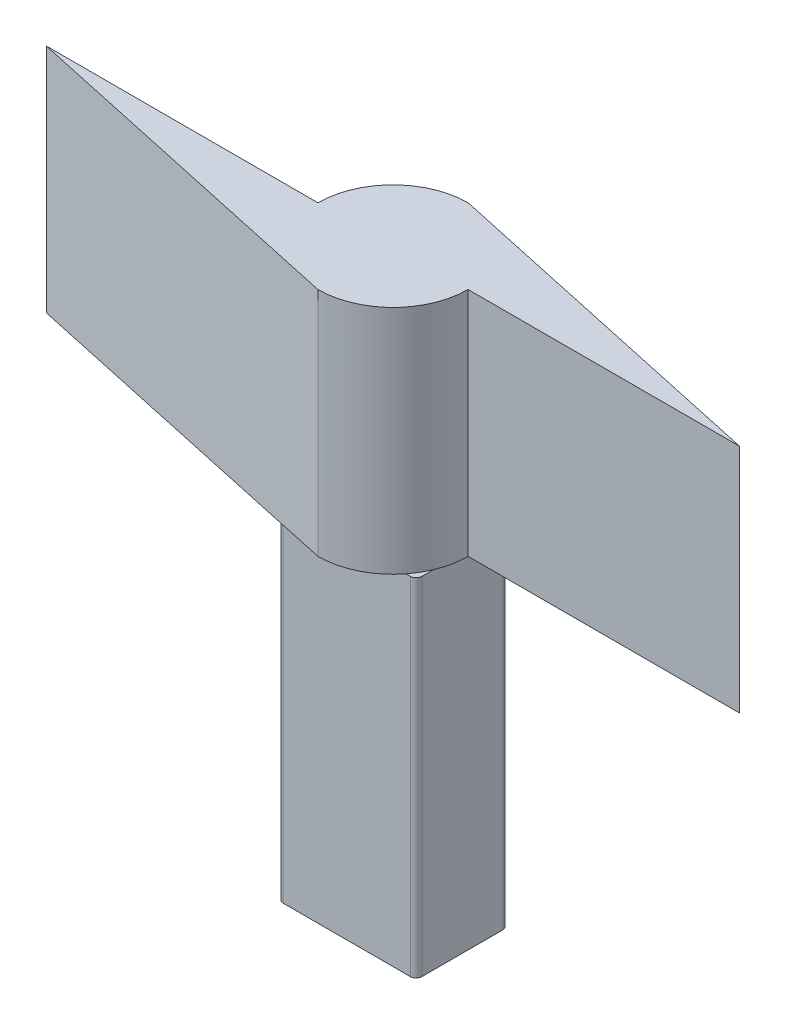
ISO-10303-21;
HEADER;
FILE_DESCRIPTION(('STEP AP214'),'2;1');
FILE_NAME('part.step','',(''),(''),'','','');
FILE_SCHEMA(('AUTOMOTIVE_DESIGN { 1 0 10303 214 1 1 1 1 }'));
ENDSEC;
DATA;
#1=APPLICATION_CONTEXT('core data for automotive mechanical design processes');
#2=APPLICATION_PROTOCOL_DEFINITION('international standard','automotive_design',2000,#1);
#3=PRODUCT_CONTEXT('',#1,'mechanical');
#4=PRODUCT('Part','Part','',(#3));
#5=PRODUCT_RELATED_PRODUCT_CATEGORY('part','',(#4));
#6=PRODUCT_DEFINITION_FORMATION('','',#4);
#7=PRODUCT_DEFINITION_CONTEXT('part definition',#1,'design');
#8=PRODUCT_DEFINITION('design','',#6,#7);
#9=PRODUCT_DEFINITION_SHAPE('','',#8);
#10=(LENGTH_UNIT() NAMED_UNIT(*) SI_UNIT(.MILLI.,.METRE.));
#11=(NAMED_UNIT(*) PLANE_ANGLE_UNIT() SI_UNIT($,.RADIAN.));
#12=(NAMED_UNIT(*) SI_UNIT($,.STERADIAN.) SOLID_ANGLE_UNIT());
#13=UNCERTAINTY_MEASURE_WITH_UNIT(LENGTH_MEASURE(1.E-05),#10,'distance_accuracy_value','');
#14=(GEOMETRIC_REPRESENTATION_CONTEXT(3) GLOBAL_UNCERTAINTY_ASSIGNED_CONTEXT((#13)) GLOBAL_UNIT_ASSIGNED_CONTEXT((#10,
#11,#12)) REPRESENTATION_CONTEXT('',''));
#15=CARTESIAN_POINT('',(0.,0.,0.));
#16=DIRECTION('',(0.,0.,1.));
#17=DIRECTION('',(1.,0.,0.));
#18=AXIS2_PLACEMENT_3D('',#15,#16,#17);
#19=CARTESIAN_POINT('',(-2.75,15.,1.75));
#20=DIRECTION('',(0.,-1.,0.));
#21=DIRECTION('',(0.,0.,-1.));
#22=AXIS2_PLACEMENT_3D('',#19,#20,#21);
#23=PLANE('',#22);
#24=CARTESIAN_POINT('',(0.,15.,0.));
#25=DIRECTION('',(0.,1.,0.));
#26=DIRECTION('',(0.,0.,1.));
#27=AXIS2_PLACEMENT_3D('',#24,#25,#26);
#28=CIRCLE('',#27,3.25);
#29=CARTESIAN_POINT('',(2.5617376914899,15.,2.));
#30=VERTEX_POINT('',#29);
#31=CARTESIAN_POINT('',(3.,15.,1.25));
#32=VERTEX_POINT('',#31);
#33=EDGE_CURVE('E11',#30,#32,#28,.T.);
#34=ORIENTED_EDGE('',*,*,#33,.F.);
#35=DIRECTION('',(1.,0.,0.));
#36=VECTOR('',#35,1.);
#37=CARTESIAN_POINT('',(-2.75,15.,2.));
#38=LINE('',#37,#36);
#39=CARTESIAN_POINT('',(2.75,15.,2.));
#40=VERTEX_POINT('',#39);
#41=EDGE_CURVE('E266',#30,#40,#38,.T.);
#42=ORIENTED_EDGE('',*,*,#41,.T.);
#43=CARTESIAN_POINT('',(2.75,15.,1.75));
#44=DIRECTION('',(0.,1.,0.));
#45=DIRECTION('',(0.,0.,1.));
#46=AXIS2_PLACEMENT_3D('',#43,#44,#45);
#47=CIRCLE('',#46,0.25);
#48=CARTESIAN_POINT('',(3.,15.,1.75));
#49=VERTEX_POINT('',#48);
#50=EDGE_CURVE('E272',#40,#49,#47,.T.);
#51=ORIENTED_EDGE('',*,*,#50,.T.);
#52=DIRECTION('',(0.,0.,-1.));
#53=VECTOR('',#52,1.);
#54=CARTESIAN_POINT('',(3.,15.,1.75));
#55=LINE('',#54,#53);
#56=EDGE_CURVE('E275',#49,#32,#55,.T.);
#57=ORIENTED_EDGE('',*,*,#56,.T.);
#58=EDGE_LOOP('',(#34,#42,#51,#57));
#59=FACE_BOUND('',#58,.T.);
#60=ADVANCED_FACE('F39',(#59),#23,.F.);
#61=CARTESIAN_POINT('',(0.,15.,0.));
#62=DIRECTION('',(0.,1.,0.));
#63=DIRECTION('',(0.,0.,1.));
#64=AXIS2_PLACEMENT_3D('',#61,#62,#63);
#65=CIRCLE('',#64,3.25);
#66=CARTESIAN_POINT('',(-2.5617376914899,15.,-2.));
#67=VERTEX_POINT('',#66);
#68=CARTESIAN_POINT('',(-3.,15.,-1.25));
#69=VERTEX_POINT('',#68);
#70=EDGE_CURVE('E49',#67,#69,#65,.T.);
#71=ORIENTED_EDGE('',*,*,#70,.F.);
#72=DIRECTION('',(-1.,0.,0.));
#73=VECTOR('',#72,1.);
#74=CARTESIAN_POINT('',(-2.75,15.,-2.));
#75=LINE('',#74,#73);
#76=CARTESIAN_POINT('',(-2.75,15.,-2.));
#77=VERTEX_POINT('',#76);
#78=EDGE_CURVE('E282',#67,#77,#75,.T.);
#79=ORIENTED_EDGE('',*,*,#78,.T.);
#80=CARTESIAN_POINT('',(-2.75,15.,-1.75));
#81=DIRECTION('',(0.,1.,0.));
#82=DIRECTION('',(0.,0.,-1.));
#83=AXIS2_PLACEMENT_3D('',#80,#81,#82);
#84=CIRCLE('',#83,0.25);
#85=CARTESIAN_POINT('',(-3.,15.,-1.75));
#86=VERTEX_POINT('',#85);
#87=EDGE_CURVE('E287',#77,#86,#84,.T.);
#88=ORIENTED_EDGE('',*,*,#87,.T.);
#89=DIRECTION('',(0.,0.,1.));
#90=VECTOR('',#89,1.);
#91=CARTESIAN_POINT('',(-3.,15.,1.75));
#92=LINE('',#91,#90);
#93=EDGE_CURVE('E291',#86,#69,#92,.T.);
#94=ORIENTED_EDGE('',*,*,#93,.T.);
#95=EDGE_LOOP('',(#71,#79,#88,#94));
#96=FACE_BOUND('',#95,.T.);
#97=ADVANCED_FACE('F460',(#96),#23,.F.);
#98=CARTESIAN_POINT('',(-2.75,0.,1.75));
#99=DIRECTION('',(0.,-1.,0.));
#100=DIRECTION('',(0.,0.,-1.));
#101=AXIS2_PLACEMENT_3D('',#98,#99,#100);
#102=PLANE('',#101);
#103=CARTESIAN_POINT('',(-2.75,0.,1.75));
#104=DIRECTION('',(0.,1.,0.));
#105=DIRECTION('',(0.,0.,-1.));
#106=AXIS2_PLACEMENT_3D('',#103,#104,#105);
#107=CIRCLE('',#106,0.25);
#108=CARTESIAN_POINT('',(-3.,0.,1.75));
#109=VERTEX_POINT('',#108);
#110=CARTESIAN_POINT('',(-2.75,0.,2.));
#111=VERTEX_POINT('',#110);
#112=EDGE_CURVE('E261',#109,#111,#107,.T.);
#113=ORIENTED_EDGE('',*,*,#112,.F.);
#114=DIRECTION('',(0.,0.,1.));
#115=VECTOR('',#114,1.);
#116=CARTESIAN_POINT('',(-3.,0.,1.75));
#117=LINE('',#116,#115);
#118=CARTESIAN_POINT('',(-3.,0.,-1.75));
#119=VERTEX_POINT('',#118);
#120=EDGE_CURVE('E267',#119,#109,#117,.T.);
#121=ORIENTED_EDGE('',*,*,#120,.F.);
#122=CARTESIAN_POINT('',(-2.75,0.,-1.75));
#123=DIRECTION('',(0.,1.,0.));
#124=DIRECTION('',(0.,0.,-1.));
#125=AXIS2_PLACEMENT_3D('',#122,#123,#124);
#126=CIRCLE('',#125,0.25);
#127=CARTESIAN_POINT('',(-2.75,0.,-2.));
#128=VERTEX_POINT('',#127);
#129=EDGE_CURVE('E313',#128,#119,#126,.T.);
#130=ORIENTED_EDGE('',*,*,#129,.F.);
#131=DIRECTION('',(-1.,0.,0.));
#132=VECTOR('',#131,1.);
#133=CARTESIAN_POINT('',(-2.75,0.,-2.));
#134=LINE('',#133,#132);
#135=CARTESIAN_POINT('',(2.75,0.,-2.));
#136=VERTEX_POINT('',#135);
#137=EDGE_CURVE('E310',#136,#128,#134,.T.);
#138=ORIENTED_EDGE('',*,*,#137,.F.);
#139=CARTESIAN_POINT('',(2.75,0.,-1.75));
#140=DIRECTION('',(0.,1.,0.));
#141=DIRECTION('',(0.,0.,-1.));
#142=AXIS2_PLACEMENT_3D('',#139,#140,#141);
#143=CIRCLE('',#142,0.25);
#144=CARTESIAN_POINT('',(3.,0.,-1.75));
#145=VERTEX_POINT('',#144);
#146=EDGE_CURVE('E307',#145,#136,#143,.T.);
#147=ORIENTED_EDGE('',*,*,#146,.F.);
#148=DIRECTION('',(0.,0.,-1.));
#149=VECTOR('',#148,1.);
#150=CARTESIAN_POINT('',(3.,0.,1.75));
#151=LINE('',#150,#149);
#152=CARTESIAN_POINT('',(3.,0.,1.75));
#153=VERTEX_POINT('',#152);
#154=EDGE_CURVE('E304',#153,#145,#151,.T.);
#155=ORIENTED_EDGE('',*,*,#154,.F.);
#156=CARTESIAN_POINT('',(2.75,0.,1.75));
#157=DIRECTION('',(0.,1.,0.));
#158=DIRECTION('',(0.,0.,1.));
#159=AXIS2_PLACEMENT_3D('',#156,#157,#158);
#160=CIRCLE('',#159,0.25);
#161=CARTESIAN_POINT('',(2.75,0.,2.));
#162=VERTEX_POINT('',#161);
#163=EDGE_CURVE('E301',#162,#153,#160,.T.);
#164=ORIENTED_EDGE('',*,*,#163,.F.);
#165=DIRECTION('',(1.,0.,0.));
#166=VECTOR('',#165,1.);
#167=CARTESIAN_POINT('',(-2.75,0.,2.));
#168=LINE('',#167,#166);
#169=EDGE_CURVE('E298',#111,#162,#168,.T.);
#170=ORIENTED_EDGE('',*,*,#169,.F.);
#171=EDGE_LOOP('',(#113,#121,#130,#138,#147,#155,#164,#170));
#172=FACE_BOUND('',#171,.T.);
#173=DIRECTION('',(-1.,0.,0.));
#174=VECTOR('',#173,1.);
#175=CARTESIAN_POINT('',(-2.5,0.,-1.5));
#176=LINE('',#175,#174);
#177=CARTESIAN_POINT('',(2.5,0.,-1.5));
#178=VERTEX_POINT('',#177);
#179=CARTESIAN_POINT('',(-2.5,0.,-1.5));
#180=VERTEX_POINT('',#179);
#181=EDGE_CURVE('E225',#178,#180,#176,.T.);
#182=ORIENTED_EDGE('',*,*,#181,.T.);
#183=DIRECTION('',(0.,0.,1.));
#184=VECTOR('',#183,1.);
#185=CARTESIAN_POINT('',(-2.5,0.,1.5));
#186=LINE('',#185,#184);
#187=CARTESIAN_POINT('',(-2.5,0.,1.5));
#188=VERTEX_POINT('',#187);
#189=EDGE_CURVE('E209',#180,#188,#186,.T.);
#190=ORIENTED_EDGE('',*,*,#189,.T.);
#191=DIRECTION('',(1.,0.,0.));
#192=VECTOR('',#191,1.);
#193=CARTESIAN_POINT('',(-2.5,0.,1.5));
#194=LINE('',#193,#192);
#195=CARTESIAN_POINT('',(2.5,0.,1.5));
#196=VERTEX_POINT('',#195);
#197=EDGE_CURVE('E214',#188,#196,#194,.T.);
#198=ORIENTED_EDGE('',*,*,#197,.T.);
#199=DIRECTION('',(0.,0.,-1.));
#200=VECTOR('',#199,1.);
#201=CARTESIAN_POINT('',(2.5,0.,1.5));
#202=LINE('',#201,#200);
#203=EDGE_CURVE('E241',#196,#178,#202,.T.);
#204=ORIENTED_EDGE('',*,*,#203,.T.);
#205=EDGE_LOOP('',(#182,#190,#198,#204));
#206=FACE_BOUND('',#205,.T.);
#207=ADVANCED_FACE('F422',(#172,#206),#102,.T.);
#208=CARTESIAN_POINT('',(-2.75,15.,1.75));
#209=DIRECTION('',(0.,-1.,0.));
#210=DIRECTION('',(0.,0.,-1.));
#211=AXIS2_PLACEMENT_3D('',#208,#209,#210);
#212=CYLINDRICAL_SURFACE('',#211,0.25);
#213=ORIENTED_EDGE('',*,*,#112,.T.);
#214=DIRECTION('',(0.,-1.,0.));
#215=VECTOR('',#214,1.);
#216=CARTESIAN_POINT('',(-2.75,15.,2.));
#217=LINE('',#216,#215);
#218=CARTESIAN_POINT('',(-2.75,15.,2.));
#219=VERTEX_POINT('',#218);
#220=EDGE_CURVE('E43',#219,#111,#217,.T.);
#221=ORIENTED_EDGE('',*,*,#220,.F.);
#222=CARTESIAN_POINT('',(-2.75,15.,1.75));
#223=DIRECTION('',(0.,1.,0.));
#224=DIRECTION('',(0.,0.,-1.));
#225=AXIS2_PLACEMENT_3D('',#222,#223,#224);
#226=CIRCLE('',#225,0.25);
#227=CARTESIAN_POINT('',(-3.,15.,1.75));
#228=VERTEX_POINT('',#227);
#229=EDGE_CURVE('E262',#228,#219,#226,.T.);
#230=ORIENTED_EDGE('',*,*,#229,.F.);
#231=DIRECTION('',(0.,-1.,0.));
#232=VECTOR('',#231,1.);
#233=CARTESIAN_POINT('',(-3.,15.,1.75));
#234=LINE('',#233,#232);
#235=EDGE_CURVE('E294',#228,#109,#234,.T.);
#236=ORIENTED_EDGE('',*,*,#235,.T.);
#237=EDGE_LOOP('',(#213,#221,#230,#236));
#238=FACE_BOUND('',#237,.T.);
#239=ADVANCED_FACE('F41',(#238),#212,.T.);
#240=CARTESIAN_POINT('',(-2.75,15.,2.));
#241=DIRECTION('',(0.,0.,-1.));
#242=DIRECTION('',(-1.,0.,0.));
#243=AXIS2_PLACEMENT_3D('',#240,#241,#242);
#244=PLANE('',#243);
#245=ORIENTED_EDGE('',*,*,#169,.T.);
#246=DIRECTION('',(0.,-1.,0.));
#247=VECTOR('',#246,1.);
#248=CARTESIAN_POINT('',(2.75,15.,2.));
#249=LINE('',#248,#247);
#250=EDGE_CURVE('E340',#40,#162,#249,.T.);
#251=ORIENTED_EDGE('',*,*,#250,.F.);
#252=ORIENTED_EDGE('',*,*,#41,.F.);
#253=EDGE_CURVE('E268',#219,#30,#38,.T.);
#254=ORIENTED_EDGE('',*,*,#253,.F.);
#255=ORIENTED_EDGE('',*,*,#220,.T.);
#256=EDGE_LOOP('',(#245,#251,#252,#254,#255));
#257=FACE_BOUND('',#256,.T.);
#258=ADVANCED_FACE('F417',(#257),#244,.F.);
#259=CARTESIAN_POINT('',(2.75,15.,1.75));
#260=DIRECTION('',(0.,-1.,0.));
#261=DIRECTION('',(0.,0.,-1.));
#262=AXIS2_PLACEMENT_3D('',#259,#260,#261);
#263=CYLINDRICAL_SURFACE('',#262,0.25);
#264=ORIENTED_EDGE('',*,*,#163,.T.);
#265=DIRECTION('',(0.,-1.,0.));
#266=VECTOR('',#265,1.);
#267=CARTESIAN_POINT('',(3.,15.,1.75));
#268=LINE('',#267,#266);
#269=EDGE_CURVE('E337',#49,#153,#268,.T.);
#270=ORIENTED_EDGE('',*,*,#269,.F.);
#271=ORIENTED_EDGE('',*,*,#50,.F.);
#272=ORIENTED_EDGE('',*,*,#250,.T.);
#273=EDGE_LOOP('',(#264,#270,#271,#272));
#274=FACE_BOUND('',#273,.T.);
#275=ADVANCED_FACE('F427',(#274),#263,.T.);
#276=CARTESIAN_POINT('',(3.,15.,1.75));
#277=DIRECTION('',(-1.,0.,0.));
#278=DIRECTION('',(0.,0.,1.));
#279=AXIS2_PLACEMENT_3D('',#276,#277,#278);
#280=PLANE('',#279);
#281=ORIENTED_EDGE('',*,*,#154,.T.);
#282=DIRECTION('',(0.,-1.,0.));
#283=VECTOR('',#282,1.);
#284=CARTESIAN_POINT('',(3.,15.,-1.75));
#285=LINE('',#284,#283);
#286=CARTESIAN_POINT('',(3.,15.,-1.75));
#287=VERTEX_POINT('',#286);
#288=EDGE_CURVE('E333',#287,#145,#285,.T.);
#289=ORIENTED_EDGE('',*,*,#288,.F.);
#290=EDGE_CURVE('E66',#32,#287,#55,.T.);
#291=ORIENTED_EDGE('',*,*,#290,.F.);
#292=ORIENTED_EDGE('',*,*,#56,.F.);
#293=ORIENTED_EDGE('',*,*,#269,.T.);
#294=EDGE_LOOP('',(#281,#289,#291,#292,#293));
#295=FACE_BOUND('',#294,.T.);
#296=ADVANCED_FACE('F450',(#295),#280,.F.);
#297=CARTESIAN_POINT('',(2.75,15.,-1.75));
#298=DIRECTION('',(0.,-1.,0.));
#299=DIRECTION('',(0.,0.,-1.));
#300=AXIS2_PLACEMENT_3D('',#297,#298,#299);
#301=CYLINDRICAL_SURFACE('',#300,0.25);
#302=ORIENTED_EDGE('',*,*,#146,.T.);
#303=DIRECTION('',(0.,-1.,0.));
#304=VECTOR('',#303,1.);
#305=CARTESIAN_POINT('',(2.75,15.,-2.));
#306=LINE('',#305,#304);
#307=CARTESIAN_POINT('',(2.75,15.,-2.));
#308=VERTEX_POINT('',#307);
#309=EDGE_CURVE('E329',#308,#136,#306,.T.);
#310=ORIENTED_EDGE('',*,*,#309,.F.);
#311=CARTESIAN_POINT('',(2.75,15.,-1.75));
#312=DIRECTION('',(0.,1.,0.));
#313=DIRECTION('',(0.,0.,-1.));
#314=AXIS2_PLACEMENT_3D('',#311,#312,#313);
#315=CIRCLE('',#314,0.25);
#316=EDGE_CURVE('E278',#287,#308,#315,.T.);
#317=ORIENTED_EDGE('',*,*,#316,.F.);
#318=ORIENTED_EDGE('',*,*,#288,.T.);
#319=EDGE_LOOP('',(#302,#310,#317,#318));
#320=FACE_BOUND('',#319,.T.);
#321=ADVANCED_FACE('F449',(#320),#301,.T.);
#322=CARTESIAN_POINT('',(-2.75,15.,-2.));
#323=DIRECTION('',(0.,0.,1.));
#324=DIRECTION('',(1.,0.,0.));
#325=AXIS2_PLACEMENT_3D('',#322,#323,#324);
#326=PLANE('',#325);
#327=ORIENTED_EDGE('',*,*,#137,.T.);
#328=DIRECTION('',(0.,-1.,0.));
#329=VECTOR('',#328,1.);
#330=CARTESIAN_POINT('',(-2.75,15.,-2.));
#331=LINE('',#330,#329);
#332=EDGE_CURVE('E325',#77,#128,#331,.T.);
#333=ORIENTED_EDGE('',*,*,#332,.F.);
#334=ORIENTED_EDGE('',*,*,#78,.F.);
#335=EDGE_CURVE('E283',#308,#67,#75,.T.);
#336=ORIENTED_EDGE('',*,*,#335,.F.);
#337=ORIENTED_EDGE('',*,*,#309,.T.);
#338=EDGE_LOOP('',(#327,#333,#334,#336,#337));
#339=FACE_BOUND('',#338,.T.);
#340=ADVANCED_FACE('F445',(#339),#326,.F.);
#341=CARTESIAN_POINT('',(-2.75,15.,-1.75));
#342=DIRECTION('',(0.,-1.,0.));
#343=DIRECTION('',(0.,0.,-1.));
#344=AXIS2_PLACEMENT_3D('',#341,#342,#343);
#345=CYLINDRICAL_SURFACE('',#344,0.25);
#346=ORIENTED_EDGE('',*,*,#129,.T.);
#347=DIRECTION('',(0.,-1.,0.));
#348=VECTOR('',#347,1.);
#349=CARTESIAN_POINT('',(-3.,15.,-1.75));
#350=LINE('',#349,#348);
#351=EDGE_CURVE('E321',#86,#119,#350,.T.);
#352=ORIENTED_EDGE('',*,*,#351,.F.);
#353=ORIENTED_EDGE('',*,*,#87,.F.);
#354=ORIENTED_EDGE('',*,*,#332,.T.);
#355=EDGE_LOOP('',(#346,#352,#353,#354));
#356=FACE_BOUND('',#355,.T.);
#357=ADVANCED_FACE('F440',(#356),#345,.T.);
#358=CARTESIAN_POINT('',(-3.,15.,1.75));
#359=DIRECTION('',(1.,0.,0.));
#360=DIRECTION('',(0.,0.,-1.));
#361=AXIS2_PLACEMENT_3D('',#358,#359,#360);
#362=PLANE('',#361);
#363=ORIENTED_EDGE('',*,*,#120,.T.);
#364=ORIENTED_EDGE('',*,*,#235,.F.);
#365=EDGE_CURVE('E290',#69,#228,#92,.T.);
#366=ORIENTED_EDGE('',*,*,#365,.F.);
#367=ORIENTED_EDGE('',*,*,#93,.F.);
#368=ORIENTED_EDGE('',*,*,#351,.T.);
#369=EDGE_LOOP('',(#363,#364,#366,#367,#368));
#370=FACE_BOUND('',#369,.T.);
#371=ADVANCED_FACE('F436',(#370),#362,.F.);
#372=CARTESIAN_POINT('',(-2.5,15.,1.5));
#373=DIRECTION('',(1.,0.,0.));
#374=DIRECTION('',(0.,0.,-1.));
#375=AXIS2_PLACEMENT_3D('',#372,#373,#374);
#376=PLANE('',#375);
#377=ORIENTED_EDGE('',*,*,#189,.F.);
#378=DIRECTION('',(0.,-1.,0.));
#379=VECTOR('',#378,1.);
#380=CARTESIAN_POINT('',(-2.5,15.,-1.5));
#381=LINE('',#380,#379);
#382=CARTESIAN_POINT('',(-2.5,15.,-1.5));
#383=VERTEX_POINT('',#382);
#384=EDGE_CURVE('E236',#383,#180,#381,.T.);
#385=ORIENTED_EDGE('',*,*,#384,.F.);
#386=DIRECTION('',(0.,0.,1.));
#387=VECTOR('',#386,1.);
#388=CARTESIAN_POINT('',(-2.5,15.,1.5));
#389=LINE('',#388,#387);
#390=CARTESIAN_POINT('',(-2.5,15.,1.5));
#391=VERTEX_POINT('',#390);
#392=EDGE_CURVE('E220',#383,#391,#389,.T.);
#393=ORIENTED_EDGE('',*,*,#392,.T.);
#394=DIRECTION('',(0.,-1.,0.));
#395=VECTOR('',#394,1.);
#396=CARTESIAN_POINT('',(-2.5,15.,1.5));
#397=LINE('',#396,#395);
#398=EDGE_CURVE('E257',#391,#188,#397,.T.);
#399=ORIENTED_EDGE('',*,*,#398,.T.);
#400=EDGE_LOOP('',(#377,#385,#393,#399));
#401=FACE_BOUND('',#400,.T.);
#402=ADVANCED_FACE('F467',(#401),#376,.T.);
#403=CARTESIAN_POINT('',(-2.5,15.,1.5));
#404=DIRECTION('',(0.,0.,-1.));
#405=DIRECTION('',(-1.,0.,0.));
#406=AXIS2_PLACEMENT_3D('',#403,#404,#405);
#407=PLANE('',#406);
#408=ORIENTED_EDGE('',*,*,#197,.F.);
#409=ORIENTED_EDGE('',*,*,#398,.F.);
#410=DIRECTION('',(1.,0.,0.));
#411=VECTOR('',#410,1.);
#412=CARTESIAN_POINT('',(-2.5,15.,1.5));
#413=LINE('',#412,#411);
#414=CARTESIAN_POINT('',(2.5,15.,1.5));
#415=VERTEX_POINT('',#414);
#416=EDGE_CURVE('E224',#391,#415,#413,.T.);
#417=ORIENTED_EDGE('',*,*,#416,.T.);
#418=DIRECTION('',(0.,-1.,0.));
#419=VECTOR('',#418,1.);
#420=CARTESIAN_POINT('',(2.5,15.,1.5));
#421=LINE('',#420,#419);
#422=EDGE_CURVE('E254',#415,#196,#421,.T.);
#423=ORIENTED_EDGE('',*,*,#422,.T.);
#424=EDGE_LOOP('',(#408,#409,#417,#423));
#425=FACE_BOUND('',#424,.T.);
#426=ADVANCED_FACE('F495',(#425),#407,.T.);
#427=CARTESIAN_POINT('',(2.5,15.,1.5));
#428=DIRECTION('',(-1.,0.,0.));
#429=DIRECTION('',(0.,0.,1.));
#430=AXIS2_PLACEMENT_3D('',#427,#428,#429);
#431=PLANE('',#430);
#432=ORIENTED_EDGE('',*,*,#203,.F.);
#433=ORIENTED_EDGE('',*,*,#422,.F.);
#434=DIRECTION('',(0.,0.,-1.));
#435=VECTOR('',#434,1.);
#436=CARTESIAN_POINT('',(2.5,15.,1.5));
#437=LINE('',#436,#435);
#438=CARTESIAN_POINT('',(2.5,15.,-1.5));
#439=VERTEX_POINT('',#438);
#440=EDGE_CURVE('E229',#415,#439,#437,.T.);
#441=ORIENTED_EDGE('',*,*,#440,.T.);
#442=DIRECTION('',(0.,-1.,0.));
#443=VECTOR('',#442,1.);
#444=CARTESIAN_POINT('',(2.5,15.,-1.5));
#445=LINE('',#444,#443);
#446=EDGE_CURVE('E251',#439,#178,#445,.T.);
#447=ORIENTED_EDGE('',*,*,#446,.T.);
#448=EDGE_LOOP('',(#432,#433,#441,#447));
#449=FACE_BOUND('',#448,.T.);
#450=ADVANCED_FACE('F502',(#449),#431,.T.);
#451=CARTESIAN_POINT('',(-2.5,15.,-1.5));
#452=DIRECTION('',(0.,0.,1.));
#453=DIRECTION('',(1.,0.,0.));
#454=AXIS2_PLACEMENT_3D('',#451,#452,#453);
#455=PLANE('',#454);
#456=ORIENTED_EDGE('',*,*,#181,.F.);
#457=ORIENTED_EDGE('',*,*,#446,.F.);
#458=DIRECTION('',(-1.,0.,0.));
#459=VECTOR('',#458,1.);
#460=CARTESIAN_POINT('',(-2.5,15.,-1.5));
#461=LINE('',#460,#459);
#462=EDGE_CURVE('E233',#439,#383,#461,.T.);
#463=ORIENTED_EDGE('',*,*,#462,.T.);
#464=ORIENTED_EDGE('',*,*,#384,.T.);
#465=EDGE_LOOP('',(#456,#457,#463,#464));
#466=FACE_BOUND('',#465,.T.);
#467=ADVANCED_FACE('F509',(#466),#455,.T.);
#468=CARTESIAN_POINT('',(0.,25.,0.));
#469=DIRECTION('',(0.,1.,0.));
#470=DIRECTION('',(0.,0.,1.));
#471=AXIS2_PLACEMENT_3D('',#468,#469,#470);
#472=PLANE('',#471);
#473=CARTESIAN_POINT('',(0.,25.,0.));
#474=DIRECTION('',(0.,1.,0.));
#475=DIRECTION('',(0.,0.,1.));
#476=AXIS2_PLACEMENT_3D('',#473,#474,#475);
#477=CIRCLE('',#476,3.25);
#478=CARTESIAN_POINT('',(0.,25.,3.25));
#479=VERTEX_POINT('',#478);
#480=CARTESIAN_POINT('',(3.25,25.,0.));
#481=VERTEX_POINT('',#480);
#482=EDGE_CURVE('E192',#479,#481,#477,.T.);
#483=ORIENTED_EDGE('',*,*,#482,.T.);
#484=DIRECTION('',(1.,0.,0.));
#485=VECTOR('',#484,1.);
#486=CARTESIAN_POINT('',(3.25,25.,0.));
#487=LINE('',#486,#485);
#488=CARTESIAN_POINT('',(15.,25.,0.));
#489=VERTEX_POINT('',#488);
#490=EDGE_CURVE('E181',#481,#489,#487,.T.);
#491=ORIENTED_EDGE('',*,*,#490,.T.);
#492=DIRECTION('',(-0.977323140026797,0.,-0.211753347005806));
#493=VECTOR('',#492,1.);
#494=CARTESIAN_POINT('',(15.,25.,0.));
#495=LINE('',#494,#493);
#496=CARTESIAN_POINT('',(0.,25.,-3.25));
#497=VERTEX_POINT('',#496);
#498=EDGE_CURVE('E191',#489,#497,#495,.T.);
#499=ORIENTED_EDGE('',*,*,#498,.T.);
#500=CARTESIAN_POINT('',(0.,25.,0.));
#501=DIRECTION('',(0.,1.,0.));
#502=DIRECTION('',(0.,0.,1.));
#503=AXIS2_PLACEMENT_3D('',#500,#501,#502);
#504=CIRCLE('',#503,3.25);
#505=CARTESIAN_POINT('',(-3.25,25.,0.));
#506=VERTEX_POINT('',#505);
#507=EDGE_CURVE('E382',#497,#506,#504,.T.);
#508=ORIENTED_EDGE('',*,*,#507,.T.);
#509=DIRECTION('',(-1.,0.,0.));
#510=VECTOR('',#509,1.);
#511=CARTESIAN_POINT('',(-3.25,25.,0.));
#512=LINE('',#511,#510);
#513=CARTESIAN_POINT('',(-15.,25.,0.));
#514=VERTEX_POINT('',#513);
#515=EDGE_CURVE('E379',#506,#514,#512,.T.);
#516=ORIENTED_EDGE('',*,*,#515,.T.);
#517=DIRECTION('',(0.977323140026797,0.,0.211753347005806));
#518=VECTOR('',#517,1.);
#519=CARTESIAN_POINT('',(-15.,25.,0.));
#520=LINE('',#519,#518);
#521=EDGE_CURVE('E197',#514,#479,#520,.T.);
#522=ORIENTED_EDGE('',*,*,#521,.T.);
#523=EDGE_LOOP('',(#483,#491,#499,#508,#516,#522));
#524=FACE_BOUND('',#523,.T.);
#525=ADVANCED_FACE('F195',(#524),#472,.T.);
#526=CARTESIAN_POINT('',(-15.,25.,0.));
#527=DIRECTION('',(0.211753347005806,0.,-0.977323140026797));
#528=DIRECTION('',(-0.977323140026797,0.,-0.211753347005806));
#529=AXIS2_PLACEMENT_3D('',#526,#527,#528);
#530=PLANE('',#529);
#531=DIRECTION('',(0.977323140026797,0.,0.211753347005806));
#532=VECTOR('',#531,1.);
#533=CARTESIAN_POINT('',(-15.,15.,0.));
#534=LINE('',#533,#532);
#535=CARTESIAN_POINT('',(-15.,15.,0.));
#536=VERTEX_POINT('',#535);
#537=CARTESIAN_POINT('',(0.,15.,3.25));
#538=VERTEX_POINT('',#537);
#539=EDGE_CURVE('E202',#536,#538,#534,.T.);
#540=ORIENTED_EDGE('',*,*,#539,.T.);
#541=DIRECTION('',(0.,-1.,0.));
#542=VECTOR('',#541,1.);
#543=CARTESIAN_POINT('',(0.,25.,3.25));
#544=LINE('',#543,#542);
#545=EDGE_CURVE('E378',#479,#538,#544,.T.);
#546=ORIENTED_EDGE('',*,*,#545,.F.);
#547=ORIENTED_EDGE('',*,*,#521,.F.);
#548=DIRECTION('',(0.,-1.,0.));
#549=VECTOR('',#548,1.);
#550=CARTESIAN_POINT('',(-15.,25.,0.));
#551=LINE('',#550,#549);
#552=EDGE_CURVE('E396',#514,#536,#551,.T.);
#553=ORIENTED_EDGE('',*,*,#552,.T.);
#554=EDGE_LOOP('',(#540,#546,#547,#553));
#555=FACE_BOUND('',#554,.T.);
#556=ADVANCED_FACE('F405',(#555),#530,.F.);
#557=CARTESIAN_POINT('',(-3.25,25.,0.));
#558=DIRECTION('',(0.,0.,1.));
#559=DIRECTION('',(1.,0.,0.));
#560=AXIS2_PLACEMENT_3D('',#557,#558,#559);
#561=PLANE('',#560);
#562=DIRECTION('',(-1.,0.,0.));
#563=VECTOR('',#562,1.);
#564=CARTESIAN_POINT('',(-3.25,15.,0.));
#565=LINE('',#564,#563);
#566=CARTESIAN_POINT('',(-3.25,15.,0.));
#567=VERTEX_POINT('',#566);
#568=EDGE_CURVE('E360',#567,#536,#565,.T.);
#569=ORIENTED_EDGE('',*,*,#568,.T.);
#570=ORIENTED_EDGE('',*,*,#552,.F.);
#571=ORIENTED_EDGE('',*,*,#515,.F.);
#572=DIRECTION('',(0.,-1.,0.));
#573=VECTOR('',#572,1.);
#574=CARTESIAN_POINT('',(-3.25,25.,0.));
#575=LINE('',#574,#573);
#576=EDGE_CURVE('E390',#506,#567,#575,.T.);
#577=ORIENTED_EDGE('',*,*,#576,.T.);
#578=EDGE_LOOP('',(#569,#570,#571,#577));
#579=FACE_BOUND('',#578,.T.);
#580=ADVANCED_FACE('F399',(#579),#561,.F.);
#581=CARTESIAN_POINT('',(0.,25.,0.));
#582=DIRECTION('',(0.,-1.,0.));
#583=DIRECTION('',(0.,0.,-1.));
#584=AXIS2_PLACEMENT_3D('',#581,#582,#583);
#585=CYLINDRICAL_SURFACE('',#584,3.25);
#586=CARTESIAN_POINT('',(0.,15.,-3.25));
#587=VERTEX_POINT('',#586);
#588=EDGE_CURVE('E353',#587,#67,#65,.T.);
#589=ORIENTED_EDGE('',*,*,#588,.T.);
#590=ORIENTED_EDGE('',*,*,#70,.T.);
#591=EDGE_CURVE('E354',#69,#567,#65,.T.);
#592=ORIENTED_EDGE('',*,*,#591,.T.);
#593=ORIENTED_EDGE('',*,*,#576,.F.);
#594=ORIENTED_EDGE('',*,*,#507,.F.);
#595=DIRECTION('',(0.,-1.,0.));
#596=VECTOR('',#595,1.);
#597=CARTESIAN_POINT('',(0.,25.,-3.25));
#598=LINE('',#597,#596);
#599=EDGE_CURVE('E216',#497,#587,#598,.T.);
#600=ORIENTED_EDGE('',*,*,#599,.T.);
#601=EDGE_LOOP('',(#589,#590,#592,#593,#594,#600));
#602=FACE_BOUND('',#601,.T.);
#603=ADVANCED_FACE('F391',(#602),#585,.T.);
#604=CARTESIAN_POINT('',(15.,25.,0.));
#605=DIRECTION('',(-0.211753347005806,0.,0.977323140026797));
#606=DIRECTION('',(0.977323140026797,0.,0.211753347005806));
#607=AXIS2_PLACEMENT_3D('',#604,#605,#606);
#608=PLANE('',#607);
#609=DIRECTION('',(-0.977323140026797,0.,-0.211753347005806));
#610=VECTOR('',#609,1.);
#611=CARTESIAN_POINT('',(15.,15.,0.));
#612=LINE('',#611,#610);
#613=CARTESIAN_POINT('',(15.,15.,0.));
#614=VERTEX_POINT('',#613);
#615=EDGE_CURVE('E362',#614,#587,#612,.T.);
#616=ORIENTED_EDGE('',*,*,#615,.T.);
#617=ORIENTED_EDGE('',*,*,#599,.F.);
#618=ORIENTED_EDGE('',*,*,#498,.F.);
#619=DIRECTION('',(0.,-1.,0.));
#620=VECTOR('',#619,1.);
#621=CARTESIAN_POINT('',(15.,25.,0.));
#622=LINE('',#621,#620);
#623=EDGE_CURVE('E187',#489,#614,#622,.T.);
#624=ORIENTED_EDGE('',*,*,#623,.T.);
#625=EDGE_LOOP('',(#616,#617,#618,#624));
#626=FACE_BOUND('',#625,.T.);
#627=ADVANCED_FACE('F387',(#626),#608,.F.);
#628=CARTESIAN_POINT('',(3.25,25.,0.));
#629=DIRECTION('',(0.,0.,-1.));
#630=DIRECTION('',(-1.,0.,0.));
#631=AXIS2_PLACEMENT_3D('',#628,#629,#630);
#632=PLANE('',#631);
#633=DIRECTION('',(1.,0.,0.));
#634=VECTOR('',#633,1.);
#635=CARTESIAN_POINT('',(3.25,15.,0.));
#636=LINE('',#635,#634);
#637=CARTESIAN_POINT('',(3.25,15.,0.));
#638=VERTEX_POINT('',#637);
#639=EDGE_CURVE('E367',#638,#614,#636,.T.);
#640=ORIENTED_EDGE('',*,*,#639,.T.);
#641=ORIENTED_EDGE('',*,*,#623,.F.);
#642=ORIENTED_EDGE('',*,*,#490,.F.);
#643=DIRECTION('',(0.,-1.,0.));
#644=VECTOR('',#643,1.);
#645=CARTESIAN_POINT('',(3.25,25.,0.));
#646=LINE('',#645,#644);
#647=EDGE_CURVE('E185',#481,#638,#646,.T.);
#648=ORIENTED_EDGE('',*,*,#647,.T.);
#649=EDGE_LOOP('',(#640,#641,#642,#648));
#650=FACE_BOUND('',#649,.T.);
#651=ADVANCED_FACE('F183',(#650),#632,.F.);
#652=CARTESIAN_POINT('',(0.,25.,0.));
#653=DIRECTION('',(0.,-1.,0.));
#654=DIRECTION('',(0.,0.,-1.));
#655=AXIS2_PLACEMENT_3D('',#652,#653,#654);
#656=CYLINDRICAL_SURFACE('',#655,3.25);
#657=EDGE_CURVE('E51',#538,#30,#28,.T.);
#658=ORIENTED_EDGE('',*,*,#657,.T.);
#659=ORIENTED_EDGE('',*,*,#33,.T.);
#660=EDGE_CURVE('E52',#32,#638,#28,.T.);
#661=ORIENTED_EDGE('',*,*,#660,.T.);
#662=ORIENTED_EDGE('',*,*,#647,.F.);
#663=ORIENTED_EDGE('',*,*,#482,.F.);
#664=ORIENTED_EDGE('',*,*,#545,.T.);
#665=EDGE_LOOP('',(#658,#659,#661,#662,#663,#664));
#666=FACE_BOUND('',#665,.T.);
#667=ADVANCED_FACE('F205',(#666),#656,.T.);
#668=CARTESIAN_POINT('',(0.,15.,0.));
#669=DIRECTION('',(0.,1.,0.));
#670=DIRECTION('',(0.,0.,1.));
#671=AXIS2_PLACEMENT_3D('',#668,#669,#670);
#672=PLANE('',#671);
#673=ORIENTED_EDGE('',*,*,#229,.T.);
#674=ORIENTED_EDGE('',*,*,#253,.T.);
#675=ORIENTED_EDGE('',*,*,#657,.F.);
#676=ORIENTED_EDGE('',*,*,#539,.F.);
#677=ORIENTED_EDGE('',*,*,#568,.F.);
#678=ORIENTED_EDGE('',*,*,#591,.F.);
#679=ORIENTED_EDGE('',*,*,#365,.T.);
#680=EDGE_LOOP('',(#673,#674,#675,#676,#677,#678,#679));
#681=FACE_BOUND('',#680,.T.);
#682=ADVANCED_FACE('F413',(#681),#672,.F.);
#683=ORIENTED_EDGE('',*,*,#660,.F.);
#684=ORIENTED_EDGE('',*,*,#290,.T.);
#685=ORIENTED_EDGE('',*,*,#316,.T.);
#686=ORIENTED_EDGE('',*,*,#335,.T.);
#687=ORIENTED_EDGE('',*,*,#588,.F.);
#688=ORIENTED_EDGE('',*,*,#615,.F.);
#689=ORIENTED_EDGE('',*,*,#639,.F.);
#690=EDGE_LOOP('',(#683,#684,#685,#686,#687,#688,#689));
#691=FACE_BOUND('',#690,.T.);
#692=ADVANCED_FACE('F566',(#691),#672,.F.);
#693=ORIENTED_EDGE('',*,*,#392,.F.);
#694=ORIENTED_EDGE('',*,*,#462,.F.);
#695=ORIENTED_EDGE('',*,*,#440,.F.);
#696=ORIENTED_EDGE('',*,*,#416,.F.);
#697=EDGE_LOOP('',(#693,#694,#695,#696));
#698=FACE_BOUND('',#697,.T.);
#699=ADVANCED_FACE('F568',(#698),#672,.F.);
#700=CLOSED_SHELL('',(#60,#97,#207,#239,#258,#275,#296,#321,#340,#357,#371,#402,#426,#450,#467,
#525,#556,#580,#603,#627,#651,#667,#682,#692,#699));
#701=MANIFOLD_SOLID_BREP('B2',#700);
#702=ADVANCED_BREP_SHAPE_REPRESENTATION('',(#18,#701),#14);
#703=SHAPE_DEFINITION_REPRESENTATION(#9,#702);
ENDSEC;
END-ISO-10303-21;
